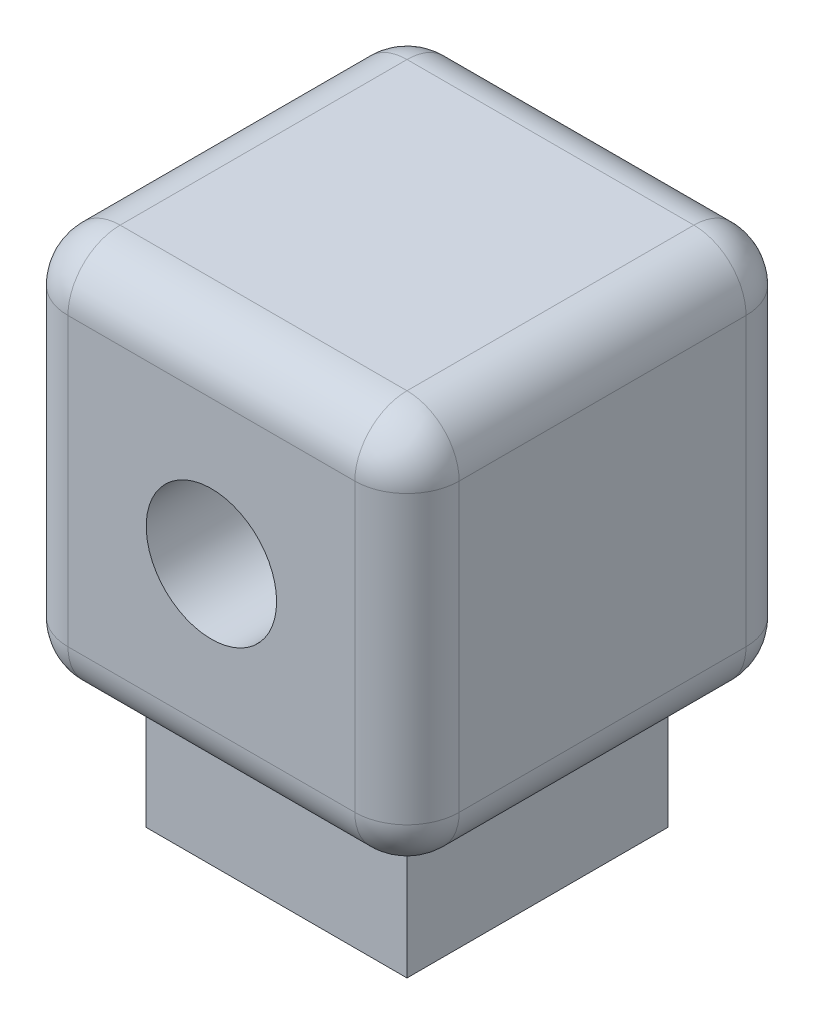
ISO-10303-21;
HEADER;
FILE_DESCRIPTION(('STEP AP214'),'2;1');
FILE_NAME('part.step','',(''),(''),'','','');
FILE_SCHEMA(('AUTOMOTIVE_DESIGN { 1 0 10303 214 1 1 1 1 }'));
ENDSEC;
DATA;
#1=APPLICATION_CONTEXT('core data for automotive mechanical design processes');
#2=APPLICATION_PROTOCOL_DEFINITION('international standard','automotive_design',2000,#1);
#3=PRODUCT_CONTEXT('',#1,'mechanical');
#4=PRODUCT('Part','Part','',(#3));
#5=PRODUCT_RELATED_PRODUCT_CATEGORY('part','',(#4));
#6=PRODUCT_DEFINITION_FORMATION('','',#4);
#7=PRODUCT_DEFINITION_CONTEXT('part definition',#1,'design');
#8=PRODUCT_DEFINITION('design','',#6,#7);
#9=PRODUCT_DEFINITION_SHAPE('','',#8);
#10=(LENGTH_UNIT() NAMED_UNIT(*) SI_UNIT(.MILLI.,.METRE.));
#11=(NAMED_UNIT(*) PLANE_ANGLE_UNIT() SI_UNIT($,.RADIAN.));
#12=(NAMED_UNIT(*) SI_UNIT($,.STERADIAN.) SOLID_ANGLE_UNIT());
#13=UNCERTAINTY_MEASURE_WITH_UNIT(LENGTH_MEASURE(1.E-05),#10,'distance_accuracy_value','');
#14=(GEOMETRIC_REPRESENTATION_CONTEXT(3) GLOBAL_UNCERTAINTY_ASSIGNED_CONTEXT((#13)) GLOBAL_UNIT_ASSIGNED_CONTEXT((#10,
#11,#12)) REPRESENTATION_CONTEXT('',''));
#15=CARTESIAN_POINT('',(0.,0.,0.));
#16=DIRECTION('',(0.,0.,1.));
#17=DIRECTION('',(1.,0.,0.));
#18=AXIS2_PLACEMENT_3D('',#15,#16,#17);
#19=CARTESIAN_POINT('',(12.9476930913001,15.,10.));
#20=DIRECTION('',(-1.,0.,0.));
#21=DIRECTION('',(0.,0.,1.));
#22=AXIS2_PLACEMENT_3D('',#19,#20,#21);
#23=PLANE('',#22);
#24=DIRECTION('',(0.,-1.,0.));
#25=VECTOR('',#24,1.);
#26=CARTESIAN_POINT('',(12.9476930913001,15.,8.));
#27=LINE('',#26,#25);
#28=CARTESIAN_POINT('',(12.9476930913001,13.,8.));
#29=VERTEX_POINT('',#28);
#30=CARTESIAN_POINT('',(12.9476930913001,2.,8.));
#31=VERTEX_POINT('',#30);
#32=EDGE_CURVE('E232',#29,#31,#27,.T.);
#33=ORIENTED_EDGE('',*,*,#32,.T.);
#34=DIRECTION('',(0.,0.,-1.));
#35=VECTOR('',#34,1.);
#36=CARTESIAN_POINT('',(12.9476930913001,2.,-5.));
#37=LINE('',#36,#35);
#38=CARTESIAN_POINT('',(12.9476930913001,2.,-3.));
#39=VERTEX_POINT('',#38);
#40=EDGE_CURVE('E238',#31,#39,#37,.T.);
#41=ORIENTED_EDGE('',*,*,#40,.T.);
#42=DIRECTION('',(0.,-1.,0.));
#43=VECTOR('',#42,1.);
#44=CARTESIAN_POINT('',(12.9476930913001,15.,-3.));
#45=LINE('',#44,#43);
#46=CARTESIAN_POINT('',(12.9476930913001,13.,-3.));
#47=VERTEX_POINT('',#46);
#48=EDGE_CURVE('E235',#39,#47,#45,.F.);
#49=ORIENTED_EDGE('',*,*,#48,.T.);
#50=DIRECTION('',(0.,0.,-1.));
#51=VECTOR('',#50,1.);
#52=CARTESIAN_POINT('',(12.9476930913001,13.,10.));
#53=LINE('',#52,#51);
#54=EDGE_CURVE('E229',#47,#29,#53,.F.);
#55=ORIENTED_EDGE('',*,*,#54,.T.);
#56=EDGE_LOOP('',(#33,#41,#49,#55));
#57=FACE_BOUND('',#56,.T.);
#58=ADVANCED_FACE('F39',(#57),#23,.F.);
#59=CARTESIAN_POINT('',(-2.05230690869991,15.,-5.));
#60=DIRECTION('',(0.,0.,1.));
#61=DIRECTION('',(1.,0.,0.));
#62=AXIS2_PLACEMENT_3D('',#59,#60,#61);
#63=PLANE('',#62);
#64=DIRECTION('',(0.,-1.,0.));
#65=VECTOR('',#64,1.);
#66=CARTESIAN_POINT('',(10.9476930913001,15.,-5.));
#67=LINE('',#66,#65);
#68=CARTESIAN_POINT('',(10.9476930913001,13.,-5.));
#69=VERTEX_POINT('',#68);
#70=CARTESIAN_POINT('',(10.9476930913001,2.,-5.));
#71=VERTEX_POINT('',#70);
#72=EDGE_CURVE('E219',#69,#71,#67,.T.);
#73=ORIENTED_EDGE('',*,*,#72,.T.);
#74=DIRECTION('',(-1.,0.,0.));
#75=VECTOR('',#74,1.);
#76=CARTESIAN_POINT('',(-2.05230690869991,2.,-5.));
#77=LINE('',#76,#75);
#78=CARTESIAN_POINT('',(-0.0523069086999055,2.,-5.));
#79=VERTEX_POINT('',#78);
#80=EDGE_CURVE('E225',#71,#79,#77,.T.);
#81=ORIENTED_EDGE('',*,*,#80,.T.);
#82=DIRECTION('',(0.,-1.,0.));
#83=VECTOR('',#82,1.);
#84=CARTESIAN_POINT('',(-0.0523069086999055,15.,-5.));
#85=LINE('',#84,#83);
#86=CARTESIAN_POINT('',(-0.0523069086999055,13.,-5.));
#87=VERTEX_POINT('',#86);
#88=EDGE_CURVE('E222',#79,#87,#85,.F.);
#89=ORIENTED_EDGE('',*,*,#88,.T.);
#90=DIRECTION('',(-1.,0.,0.));
#91=VECTOR('',#90,1.);
#92=CARTESIAN_POINT('',(-2.05230690869991,13.,-5.));
#93=LINE('',#92,#91);
#94=EDGE_CURVE('E216',#87,#69,#93,.F.);
#95=ORIENTED_EDGE('',*,*,#94,.T.);
#96=EDGE_LOOP('',(#73,#81,#89,#95));
#97=FACE_BOUND('',#96,.T.);
#98=CARTESIAN_POINT('',(5.44769309130009,7.5,-5.));
#99=DIRECTION('',(0.,0.,1.));
#100=DIRECTION('',(1.,0.,0.));
#101=AXIS2_PLACEMENT_3D('',#98,#99,#100);
#102=CIRCLE('',#101,2.5);
#103=CARTESIAN_POINT('',(7.94769309130009,7.5,-5.));
#104=VERTEX_POINT('',#103);
#105=EDGE_CURVE('E358',#104,#104,#102,.T.);
#106=ORIENTED_EDGE('',*,*,#105,.T.);
#107=EDGE_LOOP('',(#106));
#108=FACE_BOUND('',#107,.T.);
#109=ADVANCED_FACE('F406',(#97,#108),#63,.F.);
#110=CARTESIAN_POINT('',(-2.05230690869991,15.,10.));
#111=DIRECTION('',(1.,0.,0.));
#112=DIRECTION('',(0.,0.,-1.));
#113=AXIS2_PLACEMENT_3D('',#110,#111,#112);
#114=PLANE('',#113);
#115=DIRECTION('',(0.,-1.,0.));
#116=VECTOR('',#115,1.);
#117=CARTESIAN_POINT('',(-2.05230690869991,15.,-3.));
#118=LINE('',#117,#116);
#119=CARTESIAN_POINT('',(-2.05230690869991,13.,-3.));
#120=VERTEX_POINT('',#119);
#121=CARTESIAN_POINT('',(-2.05230690869991,2.,-3.));
#122=VERTEX_POINT('',#121);
#123=EDGE_CURVE('E188',#120,#122,#118,.T.);
#124=ORIENTED_EDGE('',*,*,#123,.T.);
#125=DIRECTION('',(0.,0.,1.));
#126=VECTOR('',#125,1.);
#127=CARTESIAN_POINT('',(-2.05230690869991,2.,10.));
#128=LINE('',#127,#126);
#129=CARTESIAN_POINT('',(-2.05230690869991,2.,8.));
#130=VERTEX_POINT('',#129);
#131=EDGE_CURVE('E199',#122,#130,#128,.T.);
#132=ORIENTED_EDGE('',*,*,#131,.T.);
#133=DIRECTION('',(0.,-1.,0.));
#134=VECTOR('',#133,1.);
#135=CARTESIAN_POINT('',(-2.05230690869991,15.,8.));
#136=LINE('',#135,#134);
#137=CARTESIAN_POINT('',(-2.05230690869991,13.,8.));
#138=VERTEX_POINT('',#137);
#139=EDGE_CURVE('E196',#130,#138,#136,.F.);
#140=ORIENTED_EDGE('',*,*,#139,.T.);
#141=DIRECTION('',(0.,0.,1.));
#142=VECTOR('',#141,1.);
#143=CARTESIAN_POINT('',(-2.05230690869991,13.,10.));
#144=LINE('',#143,#142);
#145=EDGE_CURVE('E184',#138,#120,#144,.F.);
#146=ORIENTED_EDGE('',*,*,#145,.T.);
#147=EDGE_LOOP('',(#124,#132,#140,#146));
#148=FACE_BOUND('',#147,.T.);
#149=ADVANCED_FACE('F412',(#148),#114,.F.);
#150=CARTESIAN_POINT('',(-2.05230690869991,15.,10.));
#151=DIRECTION('',(0.,0.,-1.));
#152=DIRECTION('',(-1.,0.,0.));
#153=AXIS2_PLACEMENT_3D('',#150,#151,#152);
#154=PLANE('',#153);
#155=DIRECTION('',(0.,-1.,0.));
#156=VECTOR('',#155,1.);
#157=CARTESIAN_POINT('',(-0.0523069086999055,15.,10.));
#158=LINE('',#157,#156);
#159=CARTESIAN_POINT('',(-0.0523069086999055,13.,10.));
#160=VERTEX_POINT('',#159);
#161=CARTESIAN_POINT('',(-0.0523069086999055,2.,10.));
#162=VERTEX_POINT('',#161);
#163=EDGE_CURVE('E248',#160,#162,#158,.T.);
#164=ORIENTED_EDGE('',*,*,#163,.T.);
#165=DIRECTION('',(1.,0.,0.));
#166=VECTOR('',#165,1.);
#167=CARTESIAN_POINT('',(12.9476930913001,2.,10.));
#168=LINE('',#167,#166);
#169=CARTESIAN_POINT('',(10.9476930913001,2.,10.));
#170=VERTEX_POINT('',#169);
#171=EDGE_CURVE('E251',#162,#170,#168,.T.);
#172=ORIENTED_EDGE('',*,*,#171,.T.);
#173=DIRECTION('',(0.,-1.,0.));
#174=VECTOR('',#173,1.);
#175=CARTESIAN_POINT('',(10.9476930913001,15.,10.));
#176=LINE('',#175,#174);
#177=CARTESIAN_POINT('',(10.9476930913001,13.,10.));
#178=VERTEX_POINT('',#177);
#179=EDGE_CURVE('E245',#170,#178,#176,.F.);
#180=ORIENTED_EDGE('',*,*,#179,.T.);
#181=DIRECTION('',(1.,0.,0.));
#182=VECTOR('',#181,1.);
#183=CARTESIAN_POINT('',(-2.05230690869991,13.,10.));
#184=LINE('',#183,#182);
#185=EDGE_CURVE('E242',#178,#160,#184,.F.);
#186=ORIENTED_EDGE('',*,*,#185,.T.);
#187=EDGE_LOOP('',(#164,#172,#180,#186));
#188=FACE_BOUND('',#187,.T.);
#189=CARTESIAN_POINT('',(5.44769309130009,7.5,10.));
#190=DIRECTION('',(0.,0.,1.));
#191=DIRECTION('',(1.,0.,0.));
#192=AXIS2_PLACEMENT_3D('',#189,#190,#191);
#193=CIRCLE('',#192,2.5);
#194=CARTESIAN_POINT('',(7.94769309130009,7.5,10.));
#195=VERTEX_POINT('',#194);
#196=EDGE_CURVE('E351',#195,#195,#193,.T.);
#197=ORIENTED_EDGE('',*,*,#196,.F.);
#198=EDGE_LOOP('',(#197));
#199=FACE_BOUND('',#198,.T.);
#200=ADVANCED_FACE('F402',(#188,#199),#154,.F.);
#201=CARTESIAN_POINT('',(0.,15.,0.));
#202=DIRECTION('',(0.,-1.,0.));
#203=DIRECTION('',(0.,0.,-1.));
#204=AXIS2_PLACEMENT_3D('',#201,#202,#203);
#205=PLANE('',#204);
#206=DIRECTION('',(-1.,0.,0.));
#207=VECTOR('',#206,1.);
#208=CARTESIAN_POINT('',(0.,15.,-3.));
#209=LINE('',#208,#207);
#210=CARTESIAN_POINT('',(10.9476930913001,15.,-3.));
#211=VERTEX_POINT('',#210);
#212=CARTESIAN_POINT('',(-0.0523069086999055,15.,-3.));
#213=VERTEX_POINT('',#212);
#214=EDGE_CURVE('E255',#211,#213,#209,.T.);
#215=ORIENTED_EDGE('',*,*,#214,.T.);
#216=DIRECTION('',(0.,0.,1.));
#217=VECTOR('',#216,1.);
#218=CARTESIAN_POINT('',(-0.0523069086999055,15.,0.));
#219=LINE('',#218,#217);
#220=CARTESIAN_POINT('',(-0.0523069086999055,15.,8.));
#221=VERTEX_POINT('',#220);
#222=EDGE_CURVE('E11',#213,#221,#219,.T.);
#223=ORIENTED_EDGE('',*,*,#222,.T.);
#224=DIRECTION('',(1.,0.,0.));
#225=VECTOR('',#224,1.);
#226=CARTESIAN_POINT('',(0.,15.,8.));
#227=LINE('',#226,#225);
#228=CARTESIAN_POINT('',(10.9476930913001,15.,8.));
#229=VERTEX_POINT('',#228);
#230=EDGE_CURVE('E49',#221,#229,#227,.T.);
#231=ORIENTED_EDGE('',*,*,#230,.T.);
#232=DIRECTION('',(0.,0.,-1.));
#233=VECTOR('',#232,1.);
#234=CARTESIAN_POINT('',(10.9476930913001,15.,0.));
#235=LINE('',#234,#233);
#236=EDGE_CURVE('E258',#229,#211,#235,.T.);
#237=ORIENTED_EDGE('',*,*,#236,.T.);
#238=EDGE_LOOP('',(#215,#223,#231,#237));
#239=FACE_BOUND('',#238,.T.);
#240=ADVANCED_FACE('F394',(#239),#205,.F.);
#241=CARTESIAN_POINT('',(0.,0.,0.));
#242=DIRECTION('',(0.,-1.,0.));
#243=DIRECTION('',(0.,0.,-1.));
#244=AXIS2_PLACEMENT_3D('',#241,#242,#243);
#245=PLANE('',#244);
#246=DIRECTION('',(1.,0.,0.));
#247=VECTOR('',#246,1.);
#248=CARTESIAN_POINT('',(-2.05230690869991,0.,8.));
#249=LINE('',#248,#247);
#250=CARTESIAN_POINT('',(10.9476930913001,0.,8.));
#251=VERTEX_POINT('',#250);
#252=CARTESIAN_POINT('',(-0.0523069086999055,0.,8.));
#253=VERTEX_POINT('',#252);
#254=EDGE_CURVE('E203',#251,#253,#249,.F.);
#255=ORIENTED_EDGE('',*,*,#254,.T.);
#256=DIRECTION('',(0.,0.,1.));
#257=VECTOR('',#256,1.);
#258=CARTESIAN_POINT('',(-0.0523069086999055,0.,-5.));
#259=LINE('',#258,#257);
#260=CARTESIAN_POINT('',(-0.0523069086999055,0.,-3.));
#261=VERTEX_POINT('',#260);
#262=EDGE_CURVE('E212',#253,#261,#259,.F.);
#263=ORIENTED_EDGE('',*,*,#262,.T.);
#264=DIRECTION('',(-1.,0.,0.));
#265=VECTOR('',#264,1.);
#266=CARTESIAN_POINT('',(12.9476930913001,0.,-3.));
#267=LINE('',#266,#265);
#268=CARTESIAN_POINT('',(10.9476930913001,0.,-3.));
#269=VERTEX_POINT('',#268);
#270=EDGE_CURVE('E209',#261,#269,#267,.F.);
#271=ORIENTED_EDGE('',*,*,#270,.T.);
#272=DIRECTION('',(0.,0.,-1.));
#273=VECTOR('',#272,1.);
#274=CARTESIAN_POINT('',(10.9476930913001,0.,10.));
#275=LINE('',#274,#273);
#276=EDGE_CURVE('E206',#269,#251,#275,.F.);
#277=ORIENTED_EDGE('',*,*,#276,.T.);
#278=EDGE_LOOP('',(#255,#263,#271,#277));
#279=FACE_BOUND('',#278,.T.);
#280=DIRECTION('',(0.,0.,1.));
#281=VECTOR('',#280,1.);
#282=CARTESIAN_POINT('',(10.4476930913001,0.,7.5));
#283=LINE('',#282,#281);
#284=CARTESIAN_POINT('',(10.4476930913001,0.,-2.5));
#285=VERTEX_POINT('',#284);
#286=CARTESIAN_POINT('',(10.4476930913001,0.,7.5));
#287=VERTEX_POINT('',#286);
#288=EDGE_CURVE('E182',#285,#287,#283,.T.);
#289=ORIENTED_EDGE('',*,*,#288,.F.);
#290=DIRECTION('',(1.,0.,0.));
#291=VECTOR('',#290,1.);
#292=CARTESIAN_POINT('',(0.447693091300095,0.,-2.5));
#293=LINE('',#292,#291);
#294=CARTESIAN_POINT('',(0.447693091300095,0.,-2.5));
#295=VERTEX_POINT('',#294);
#296=EDGE_CURVE('E179',#295,#285,#293,.T.);
#297=ORIENTED_EDGE('',*,*,#296,.F.);
#298=DIRECTION('',(0.,0.,-1.));
#299=VECTOR('',#298,1.);
#300=CARTESIAN_POINT('',(0.447693091300094,0.,7.5));
#301=LINE('',#300,#299);
#302=CARTESIAN_POINT('',(0.447693091300094,0.,7.5));
#303=VERTEX_POINT('',#302);
#304=EDGE_CURVE('E376',#303,#295,#301,.T.);
#305=ORIENTED_EDGE('',*,*,#304,.F.);
#306=DIRECTION('',(-1.,0.,0.));
#307=VECTOR('',#306,1.);
#308=CARTESIAN_POINT('',(0.447693091300094,0.,7.5));
#309=LINE('',#308,#307);
#310=EDGE_CURVE('E373',#287,#303,#309,.T.);
#311=ORIENTED_EDGE('',*,*,#310,.F.);
#312=EDGE_LOOP('',(#289,#297,#305,#311));
#313=FACE_BOUND('',#312,.T.);
#314=ADVANCED_FACE('F392',(#279,#313),#245,.T.);
#315=CARTESIAN_POINT('',(10.4476930913001,-5.,7.5));
#316=DIRECTION('',(-1.,0.,0.));
#317=DIRECTION('',(0.,0.,1.));
#318=AXIS2_PLACEMENT_3D('',#315,#316,#317);
#319=PLANE('',#318);
#320=ORIENTED_EDGE('',*,*,#288,.T.);
#321=DIRECTION('',(0.,1.,0.));
#322=VECTOR('',#321,1.);
#323=CARTESIAN_POINT('',(10.4476930913001,-5.,7.5));
#324=LINE('',#323,#322);
#325=CARTESIAN_POINT('',(10.4476930913001,-5.,7.5));
#326=VERTEX_POINT('',#325);
#327=EDGE_CURVE('E161',#326,#287,#324,.T.);
#328=ORIENTED_EDGE('',*,*,#327,.F.);
#329=DIRECTION('',(0.,0.,1.));
#330=VECTOR('',#329,1.);
#331=CARTESIAN_POINT('',(10.4476930913001,-5.,7.5));
#332=LINE('',#331,#330);
#333=CARTESIAN_POINT('',(10.4476930913001,-5.,-2.5));
#334=VERTEX_POINT('',#333);
#335=EDGE_CURVE('E169',#334,#326,#332,.T.);
#336=ORIENTED_EDGE('',*,*,#335,.F.);
#337=DIRECTION('',(0.,1.,0.));
#338=VECTOR('',#337,1.);
#339=CARTESIAN_POINT('',(10.4476930913001,-5.,-2.5));
#340=LINE('',#339,#338);
#341=EDGE_CURVE('E370',#334,#285,#340,.T.);
#342=ORIENTED_EDGE('',*,*,#341,.T.);
#343=EDGE_LOOP('',(#320,#328,#336,#342));
#344=FACE_BOUND('',#343,.T.);
#345=ADVANCED_FACE('F181',(#344),#319,.F.);
#346=CARTESIAN_POINT('',(0.447693091300094,-5.,7.5));
#347=DIRECTION('',(0.,0.,-1.));
#348=DIRECTION('',(-1.,0.,0.));
#349=AXIS2_PLACEMENT_3D('',#346,#347,#348);
#350=PLANE('',#349);
#351=ORIENTED_EDGE('',*,*,#310,.T.);
#352=DIRECTION('',(0.,1.,0.));
#353=VECTOR('',#352,1.);
#354=CARTESIAN_POINT('',(0.447693091300094,-5.,7.5));
#355=LINE('',#354,#353);
#356=CARTESIAN_POINT('',(0.447693091300094,-5.,7.5));
#357=VERTEX_POINT('',#356);
#358=EDGE_CURVE('E164',#357,#303,#355,.T.);
#359=ORIENTED_EDGE('',*,*,#358,.F.);
#360=DIRECTION('',(-1.,0.,0.));
#361=VECTOR('',#360,1.);
#362=CARTESIAN_POINT('',(0.447693091300094,-5.,7.5));
#363=LINE('',#362,#361);
#364=EDGE_CURVE('E156',#326,#357,#363,.T.);
#365=ORIENTED_EDGE('',*,*,#364,.F.);
#366=ORIENTED_EDGE('',*,*,#327,.T.);
#367=EDGE_LOOP('',(#351,#359,#365,#366));
#368=FACE_BOUND('',#367,.T.);
#369=ADVANCED_FACE('F159',(#368),#350,.F.);
#370=CARTESIAN_POINT('',(0.447693091300094,-5.,7.5));
#371=DIRECTION('',(1.,0.,0.));
#372=DIRECTION('',(0.,0.,-1.));
#373=AXIS2_PLACEMENT_3D('',#370,#371,#372);
#374=PLANE('',#373);
#375=ORIENTED_EDGE('',*,*,#304,.T.);
#376=DIRECTION('',(0.,1.,0.));
#377=VECTOR('',#376,1.);
#378=CARTESIAN_POINT('',(0.447693091300095,-5.,-2.5));
#379=LINE('',#378,#377);
#380=CARTESIAN_POINT('',(0.447693091300095,-5.,-2.5));
#381=VERTEX_POINT('',#380);
#382=EDGE_CURVE('E190',#381,#295,#379,.T.);
#383=ORIENTED_EDGE('',*,*,#382,.F.);
#384=DIRECTION('',(0.,0.,-1.));
#385=VECTOR('',#384,1.);
#386=CARTESIAN_POINT('',(0.447693091300094,-5.,7.5));
#387=LINE('',#386,#385);
#388=EDGE_CURVE('E168',#357,#381,#387,.T.);
#389=ORIENTED_EDGE('',*,*,#388,.F.);
#390=ORIENTED_EDGE('',*,*,#358,.T.);
#391=EDGE_LOOP('',(#375,#383,#389,#390));
#392=FACE_BOUND('',#391,.T.);
#393=ADVANCED_FACE('F390',(#392),#374,.F.);
#394=CARTESIAN_POINT('',(0.447693091300095,-5.,-2.5));
#395=DIRECTION('',(0.,0.,1.));
#396=DIRECTION('',(1.,0.,0.));
#397=AXIS2_PLACEMENT_3D('',#394,#395,#396);
#398=PLANE('',#397);
#399=ORIENTED_EDGE('',*,*,#296,.T.);
#400=ORIENTED_EDGE('',*,*,#341,.F.);
#401=DIRECTION('',(1.,0.,0.));
#402=VECTOR('',#401,1.);
#403=CARTESIAN_POINT('',(0.447693091300095,-5.,-2.5));
#404=LINE('',#403,#402);
#405=EDGE_CURVE('E174',#381,#334,#404,.T.);
#406=ORIENTED_EDGE('',*,*,#405,.F.);
#407=ORIENTED_EDGE('',*,*,#382,.T.);
#408=EDGE_LOOP('',(#399,#400,#406,#407));
#409=FACE_BOUND('',#408,.T.);
#410=ADVANCED_FACE('F388',(#409),#398,.F.);
#411=CARTESIAN_POINT('',(0.,-5.,0.));
#412=DIRECTION('',(0.,-1.,0.));
#413=DIRECTION('',(0.,0.,-1.));
#414=AXIS2_PLACEMENT_3D('',#411,#412,#413);
#415=PLANE('',#414);
#416=ORIENTED_EDGE('',*,*,#335,.T.);
#417=ORIENTED_EDGE('',*,*,#364,.T.);
#418=ORIENTED_EDGE('',*,*,#388,.T.);
#419=ORIENTED_EDGE('',*,*,#405,.T.);
#420=EDGE_LOOP('',(#416,#417,#418,#419));
#421=FACE_BOUND('',#420,.T.);
#422=ADVANCED_FACE('F172',(#421),#415,.T.);
#423=CARTESIAN_POINT('',(5.44769309130009,7.5,-5.));
#424=DIRECTION('',(0.,0.,1.));
#425=DIRECTION('',(1.,0.,0.));
#426=AXIS2_PLACEMENT_3D('',#423,#424,#425);
#427=CYLINDRICAL_SURFACE('',#426,2.5);
#428=ORIENTED_EDGE('',*,*,#105,.F.);
#429=EDGE_LOOP('',(#428));
#430=FACE_BOUND('',#429,.T.);
#431=ORIENTED_EDGE('',*,*,#196,.T.);
#432=EDGE_LOOP('',(#431));
#433=FACE_BOUND('',#432,.T.);
#434=ADVANCED_FACE('F491',(#430,#433),#427,.F.);
#435=CARTESIAN_POINT('',(10.9476930913001,13.,0.));
#436=DIRECTION('',(0.,0.,-1.));
#437=DIRECTION('',(-1.,0.,0.));
#438=AXIS2_PLACEMENT_3D('',#435,#436,#437);
#439=CYLINDRICAL_SURFACE('',#438,2.);
#440=CARTESIAN_POINT('',(10.9476930913001,13.,-3.));
#441=DIRECTION('',(0.,0.,-1.));
#442=DIRECTION('',(-1.,0.,0.));
#443=AXIS2_PLACEMENT_3D('',#440,#441,#442);
#444=CIRCLE('',#443,2.);
#445=EDGE_CURVE('E43',#211,#47,#444,.T.);
#446=ORIENTED_EDGE('',*,*,#445,.F.);
#447=ORIENTED_EDGE('',*,*,#236,.F.);
#448=CARTESIAN_POINT('',(10.9476930913001,13.,8.));
#449=DIRECTION('',(0.,0.,1.));
#450=DIRECTION('',(1.,0.,0.));
#451=AXIS2_PLACEMENT_3D('',#448,#449,#450);
#452=CIRCLE('',#451,2.);
#453=EDGE_CURVE('E342',#29,#229,#452,.T.);
#454=ORIENTED_EDGE('',*,*,#453,.F.);
#455=ORIENTED_EDGE('',*,*,#54,.F.);
#456=EDGE_LOOP('',(#446,#447,#454,#455));
#457=FACE_BOUND('',#456,.T.);
#458=ADVANCED_FACE('F41',(#457),#439,.T.);
#459=CARTESIAN_POINT('',(10.9476930913001,13.,-3.));
#460=DIRECTION('',(0.,0.,1.));
#461=DIRECTION('',(1.,0.,0.));
#462=AXIS2_PLACEMENT_3D('',#459,#460,#461);
#463=SPHERICAL_SURFACE('',#462,2.);
#464=CARTESIAN_POINT('',(10.9476930913001,13.,-3.));
#465=DIRECTION('',(1.,0.,0.));
#466=DIRECTION('',(0.,0.,-1.));
#467=AXIS2_PLACEMENT_3D('',#464,#465,#466);
#468=CIRCLE('',#467,2.);
#469=EDGE_CURVE('E335',#211,#69,#468,.F.);
#470=ORIENTED_EDGE('',*,*,#469,.F.);
#471=ORIENTED_EDGE('',*,*,#445,.T.);
#472=CARTESIAN_POINT('',(10.9476930913001,13.,-3.));
#473=DIRECTION('',(0.,1.,0.));
#474=DIRECTION('',(0.,0.,1.));
#475=AXIS2_PLACEMENT_3D('',#472,#473,#474);
#476=CIRCLE('',#475,2.);
#477=EDGE_CURVE('E339',#69,#47,#476,.F.);
#478=ORIENTED_EDGE('',*,*,#477,.F.);
#479=EDGE_LOOP('',(#470,#471,#478));
#480=FACE_BOUND('',#479,.T.);
#481=ADVANCED_FACE('F486',(#480),#463,.T.);
#482=CARTESIAN_POINT('',(10.9476930913001,13.,8.));
#483=DIRECTION('',(0.,0.,1.));
#484=DIRECTION('',(1.,0.,0.));
#485=AXIS2_PLACEMENT_3D('',#482,#483,#484);
#486=SPHERICAL_SURFACE('',#485,2.);
#487=CARTESIAN_POINT('',(10.9476930913001,13.,8.));
#488=DIRECTION('',(0.,1.,0.));
#489=DIRECTION('',(0.,0.,1.));
#490=AXIS2_PLACEMENT_3D('',#487,#488,#489);
#491=CIRCLE('',#490,2.);
#492=EDGE_CURVE('E327',#29,#178,#491,.F.);
#493=ORIENTED_EDGE('',*,*,#492,.F.);
#494=ORIENTED_EDGE('',*,*,#453,.T.);
#495=CARTESIAN_POINT('',(10.9476930913001,13.,8.));
#496=DIRECTION('',(1.,0.,0.));
#497=DIRECTION('',(0.,0.,-1.));
#498=AXIS2_PLACEMENT_3D('',#495,#496,#497);
#499=CIRCLE('',#498,2.);
#500=EDGE_CURVE('E331',#178,#229,#499,.F.);
#501=ORIENTED_EDGE('',*,*,#500,.F.);
#502=EDGE_LOOP('',(#493,#494,#501));
#503=FACE_BOUND('',#502,.T.);
#504=ADVANCED_FACE('F483',(#503),#486,.T.);
#505=CARTESIAN_POINT('',(10.9476930913001,15.,-3.));
#506=DIRECTION('',(0.,-1.,0.));
#507=DIRECTION('',(0.,0.,-1.));
#508=AXIS2_PLACEMENT_3D('',#505,#506,#507);
#509=CYLINDRICAL_SURFACE('',#508,2.);
#510=ORIENTED_EDGE('',*,*,#477,.T.);
#511=ORIENTED_EDGE('',*,*,#48,.F.);
#512=CARTESIAN_POINT('',(10.9476930913001,2.,-3.));
#513=DIRECTION('',(0.,-1.,0.));
#514=DIRECTION('',(0.,0.,-1.));
#515=AXIS2_PLACEMENT_3D('',#512,#513,#514);
#516=CIRCLE('',#515,2.);
#517=EDGE_CURVE('E320',#71,#39,#516,.T.);
#518=ORIENTED_EDGE('',*,*,#517,.F.);
#519=ORIENTED_EDGE('',*,*,#72,.F.);
#520=EDGE_LOOP('',(#510,#511,#518,#519));
#521=FACE_BOUND('',#520,.T.);
#522=ADVANCED_FACE('F479',(#521),#509,.T.);
#523=CARTESIAN_POINT('',(0.,13.,-3.));
#524=DIRECTION('',(-1.,0.,0.));
#525=DIRECTION('',(0.,0.,1.));
#526=AXIS2_PLACEMENT_3D('',#523,#524,#525);
#527=CYLINDRICAL_SURFACE('',#526,2.);
#528=ORIENTED_EDGE('',*,*,#469,.T.);
#529=ORIENTED_EDGE('',*,*,#94,.F.);
#530=CARTESIAN_POINT('',(-0.0523069086999055,13.,-3.));
#531=DIRECTION('',(-1.,0.,0.));
#532=DIRECTION('',(0.,0.,1.));
#533=AXIS2_PLACEMENT_3D('',#530,#531,#532);
#534=CIRCLE('',#533,2.);
#535=EDGE_CURVE('E316',#213,#87,#534,.T.);
#536=ORIENTED_EDGE('',*,*,#535,.F.);
#537=ORIENTED_EDGE('',*,*,#214,.F.);
#538=EDGE_LOOP('',(#528,#529,#536,#537));
#539=FACE_BOUND('',#538,.T.);
#540=ADVANCED_FACE('F475',(#539),#527,.T.);
#541=CARTESIAN_POINT('',(-0.0523069086999055,13.,0.));
#542=DIRECTION('',(0.,0.,1.));
#543=DIRECTION('',(1.,0.,0.));
#544=AXIS2_PLACEMENT_3D('',#541,#542,#543);
#545=CYLINDRICAL_SURFACE('',#544,2.);
#546=CARTESIAN_POINT('',(-0.0523069086999055,13.,8.));
#547=DIRECTION('',(0.,0.,1.));
#548=DIRECTION('',(1.,0.,0.));
#549=AXIS2_PLACEMENT_3D('',#546,#547,#548);
#550=CIRCLE('',#549,2.);
#551=EDGE_CURVE('E309',#221,#138,#550,.T.);
#552=ORIENTED_EDGE('',*,*,#551,.F.);
#553=ORIENTED_EDGE('',*,*,#222,.F.);
#554=CARTESIAN_POINT('',(-0.0523069086999055,13.,-3.));
#555=DIRECTION('',(0.,0.,-1.));
#556=DIRECTION('',(-1.,0.,0.));
#557=AXIS2_PLACEMENT_3D('',#554,#555,#556);
#558=CIRCLE('',#557,2.);
#559=EDGE_CURVE('E312',#120,#213,#558,.T.);
#560=ORIENTED_EDGE('',*,*,#559,.F.);
#561=ORIENTED_EDGE('',*,*,#145,.F.);
#562=EDGE_LOOP('',(#552,#553,#560,#561));
#563=FACE_BOUND('',#562,.T.);
#564=ADVANCED_FACE('F471',(#563),#545,.T.);
#565=CARTESIAN_POINT('',(0.,13.,8.));
#566=DIRECTION('',(1.,0.,0.));
#567=DIRECTION('',(0.,0.,-1.));
#568=AXIS2_PLACEMENT_3D('',#565,#566,#567);
#569=CYLINDRICAL_SURFACE('',#568,2.);
#570=ORIENTED_EDGE('',*,*,#500,.T.);
#571=ORIENTED_EDGE('',*,*,#230,.F.);
#572=CARTESIAN_POINT('',(-0.0523069086999055,13.,8.));
#573=DIRECTION('',(-1.,0.,0.));
#574=DIRECTION('',(0.,0.,1.));
#575=AXIS2_PLACEMENT_3D('',#572,#573,#574);
#576=CIRCLE('',#575,2.);
#577=EDGE_CURVE('E57',#160,#221,#576,.T.);
#578=ORIENTED_EDGE('',*,*,#577,.F.);
#579=ORIENTED_EDGE('',*,*,#185,.F.);
#580=EDGE_LOOP('',(#570,#571,#578,#579));
#581=FACE_BOUND('',#580,.T.);
#582=ADVANCED_FACE('F467',(#581),#569,.T.);
#583=CARTESIAN_POINT('',(10.9476930913001,15.,8.));
#584=DIRECTION('',(0.,-1.,0.));
#585=DIRECTION('',(0.,0.,-1.));
#586=AXIS2_PLACEMENT_3D('',#583,#584,#585);
#587=CYLINDRICAL_SURFACE('',#586,2.);
#588=ORIENTED_EDGE('',*,*,#492,.T.);
#589=ORIENTED_EDGE('',*,*,#179,.F.);
#590=CARTESIAN_POINT('',(10.9476930913001,2.,8.));
#591=DIRECTION('',(0.,-1.,0.));
#592=DIRECTION('',(0.,0.,-1.));
#593=AXIS2_PLACEMENT_3D('',#590,#591,#592);
#594=CIRCLE('',#593,2.);
#595=EDGE_CURVE('E303',#31,#170,#594,.T.);
#596=ORIENTED_EDGE('',*,*,#595,.F.);
#597=ORIENTED_EDGE('',*,*,#32,.F.);
#598=EDGE_LOOP('',(#588,#589,#596,#597));
#599=FACE_BOUND('',#598,.T.);
#600=ADVANCED_FACE('F463',(#599),#587,.T.);
#601=CARTESIAN_POINT('',(10.9476930913001,2.,10.));
#602=DIRECTION('',(0.,0.,1.));
#603=DIRECTION('',(1.,0.,0.));
#604=AXIS2_PLACEMENT_3D('',#601,#602,#603);
#605=CYLINDRICAL_SURFACE('',#604,2.);
#606=CARTESIAN_POINT('',(10.9476930913001,2.,-3.));
#607=DIRECTION('',(0.,0.,-1.));
#608=DIRECTION('',(-1.,0.,0.));
#609=AXIS2_PLACEMENT_3D('',#606,#607,#608);
#610=CIRCLE('',#609,2.);
#611=EDGE_CURVE('E323',#39,#269,#610,.T.);
#612=ORIENTED_EDGE('',*,*,#611,.F.);
#613=ORIENTED_EDGE('',*,*,#40,.F.);
#614=CARTESIAN_POINT('',(10.9476930913001,2.,8.));
#615=DIRECTION('',(0.,0.,1.));
#616=DIRECTION('',(1.,0.,0.));
#617=AXIS2_PLACEMENT_3D('',#614,#615,#616);
#618=CIRCLE('',#617,2.);
#619=EDGE_CURVE('E299',#251,#31,#618,.T.);
#620=ORIENTED_EDGE('',*,*,#619,.F.);
#621=ORIENTED_EDGE('',*,*,#276,.F.);
#622=EDGE_LOOP('',(#612,#613,#620,#621));
#623=FACE_BOUND('',#622,.T.);
#624=ADVANCED_FACE('F459',(#623),#605,.T.);
#625=CARTESIAN_POINT('',(10.9476930913001,2.,-3.));
#626=DIRECTION('',(0.,0.,1.));
#627=DIRECTION('',(1.,0.,0.));
#628=AXIS2_PLACEMENT_3D('',#625,#626,#627);
#629=SPHERICAL_SURFACE('',#628,2.);
#630=ORIENTED_EDGE('',*,*,#517,.T.);
#631=ORIENTED_EDGE('',*,*,#611,.T.);
#632=CARTESIAN_POINT('',(10.9476930913001,2.,-3.));
#633=DIRECTION('',(1.,0.,0.));
#634=DIRECTION('',(0.,0.,-1.));
#635=AXIS2_PLACEMENT_3D('',#632,#633,#634);
#636=CIRCLE('',#635,2.);
#637=EDGE_CURVE('E295',#71,#269,#636,.F.);
#638=ORIENTED_EDGE('',*,*,#637,.F.);
#639=EDGE_LOOP('',(#630,#631,#638));
#640=FACE_BOUND('',#639,.T.);
#641=ADVANCED_FACE('F455',(#640),#629,.T.);
#642=CARTESIAN_POINT('',(-0.0523069086999055,13.,-3.));
#643=DIRECTION('',(0.,0.,1.));
#644=DIRECTION('',(1.,0.,0.));
#645=AXIS2_PLACEMENT_3D('',#642,#643,#644);
#646=SPHERICAL_SURFACE('',#645,2.);
#647=ORIENTED_EDGE('',*,*,#559,.T.);
#648=ORIENTED_EDGE('',*,*,#535,.T.);
#649=CARTESIAN_POINT('',(-0.0523069086999055,13.,-3.));
#650=DIRECTION('',(0.,1.,0.));
#651=DIRECTION('',(0.,0.,1.));
#652=AXIS2_PLACEMENT_3D('',#649,#650,#651);
#653=CIRCLE('',#652,2.);
#654=EDGE_CURVE('E291',#120,#87,#653,.F.);
#655=ORIENTED_EDGE('',*,*,#654,.F.);
#656=EDGE_LOOP('',(#647,#648,#655));
#657=FACE_BOUND('',#656,.T.);
#658=ADVANCED_FACE('F452',(#657),#646,.T.);
#659=CARTESIAN_POINT('',(-0.0523069086999055,13.,8.));
#660=DIRECTION('',(0.,0.,1.));
#661=DIRECTION('',(1.,0.,0.));
#662=AXIS2_PLACEMENT_3D('',#659,#660,#661);
#663=SPHERICAL_SURFACE('',#662,2.);
#664=ORIENTED_EDGE('',*,*,#577,.T.);
#665=ORIENTED_EDGE('',*,*,#551,.T.);
#666=CARTESIAN_POINT('',(-0.0523069086999055,13.,8.));
#667=DIRECTION('',(0.,1.,0.));
#668=DIRECTION('',(0.,0.,1.));
#669=AXIS2_PLACEMENT_3D('',#666,#667,#668);
#670=CIRCLE('',#669,2.);
#671=EDGE_CURVE('E287',#160,#138,#670,.F.);
#672=ORIENTED_EDGE('',*,*,#671,.F.);
#673=EDGE_LOOP('',(#664,#665,#672));
#674=FACE_BOUND('',#673,.T.);
#675=ADVANCED_FACE('F448',(#674),#663,.T.);
#676=CARTESIAN_POINT('',(10.9476930913001,2.,8.));
#677=DIRECTION('',(0.,0.,1.));
#678=DIRECTION('',(1.,0.,0.));
#679=AXIS2_PLACEMENT_3D('',#676,#677,#678);
#680=SPHERICAL_SURFACE('',#679,2.);
#681=ORIENTED_EDGE('',*,*,#619,.T.);
#682=ORIENTED_EDGE('',*,*,#595,.T.);
#683=CARTESIAN_POINT('',(10.9476930913001,2.,8.));
#684=DIRECTION('',(1.,0.,0.));
#685=DIRECTION('',(0.,0.,-1.));
#686=AXIS2_PLACEMENT_3D('',#683,#684,#685);
#687=CIRCLE('',#686,2.);
#688=EDGE_CURVE('E284',#251,#170,#687,.F.);
#689=ORIENTED_EDGE('',*,*,#688,.F.);
#690=EDGE_LOOP('',(#681,#682,#689));
#691=FACE_BOUND('',#690,.T.);
#692=ADVANCED_FACE('F444',(#691),#680,.T.);
#693=CARTESIAN_POINT('',(-2.05230690869991,2.,-3.));
#694=DIRECTION('',(1.,0.,0.));
#695=DIRECTION('',(0.,0.,-1.));
#696=AXIS2_PLACEMENT_3D('',#693,#694,#695);
#697=CYLINDRICAL_SURFACE('',#696,2.);
#698=ORIENTED_EDGE('',*,*,#637,.T.);
#699=ORIENTED_EDGE('',*,*,#270,.F.);
#700=CARTESIAN_POINT('',(-0.0523069086999055,2.,-3.));
#701=DIRECTION('',(-1.,0.,0.));
#702=DIRECTION('',(0.,0.,1.));
#703=AXIS2_PLACEMENT_3D('',#700,#701,#702);
#704=CIRCLE('',#703,2.);
#705=EDGE_CURVE('E280',#79,#261,#704,.T.);
#706=ORIENTED_EDGE('',*,*,#705,.F.);
#707=ORIENTED_EDGE('',*,*,#80,.F.);
#708=EDGE_LOOP('',(#698,#699,#706,#707));
#709=FACE_BOUND('',#708,.T.);
#710=ADVANCED_FACE('F440',(#709),#697,.T.);
#711=CARTESIAN_POINT('',(-0.0523069086999055,15.,-3.));
#712=DIRECTION('',(0.,-1.,0.));
#713=DIRECTION('',(0.,0.,-1.));
#714=AXIS2_PLACEMENT_3D('',#711,#712,#713);
#715=CYLINDRICAL_SURFACE('',#714,2.);
#716=ORIENTED_EDGE('',*,*,#654,.T.);
#717=ORIENTED_EDGE('',*,*,#88,.F.);
#718=CARTESIAN_POINT('',(-0.0523069086999055,2.,-3.));
#719=DIRECTION('',(0.,-1.,0.));
#720=DIRECTION('',(0.,0.,-1.));
#721=AXIS2_PLACEMENT_3D('',#718,#719,#720);
#722=CIRCLE('',#721,2.);
#723=EDGE_CURVE('E277',#122,#79,#722,.T.);
#724=ORIENTED_EDGE('',*,*,#723,.F.);
#725=ORIENTED_EDGE('',*,*,#123,.F.);
#726=EDGE_LOOP('',(#716,#717,#724,#725));
#727=FACE_BOUND('',#726,.T.);
#728=ADVANCED_FACE('F436',(#727),#715,.T.);
#729=CARTESIAN_POINT('',(-0.0523069086999055,15.,8.));
#730=DIRECTION('',(0.,-1.,0.));
#731=DIRECTION('',(0.,0.,-1.));
#732=AXIS2_PLACEMENT_3D('',#729,#730,#731);
#733=CYLINDRICAL_SURFACE('',#732,2.);
#734=ORIENTED_EDGE('',*,*,#671,.T.);
#735=ORIENTED_EDGE('',*,*,#139,.F.);
#736=CARTESIAN_POINT('',(-0.0523069086999055,2.,8.));
#737=DIRECTION('',(0.,-1.,0.));
#738=DIRECTION('',(0.,0.,-1.));
#739=AXIS2_PLACEMENT_3D('',#736,#737,#738);
#740=CIRCLE('',#739,2.);
#741=EDGE_CURVE('E273',#162,#130,#740,.T.);
#742=ORIENTED_EDGE('',*,*,#741,.F.);
#743=ORIENTED_EDGE('',*,*,#163,.F.);
#744=EDGE_LOOP('',(#734,#735,#742,#743));
#745=FACE_BOUND('',#744,.T.);
#746=ADVANCED_FACE('F432',(#745),#733,.T.);
#747=CARTESIAN_POINT('',(-2.05230690869991,2.,8.));
#748=DIRECTION('',(-1.,0.,0.));
#749=DIRECTION('',(0.,0.,1.));
#750=AXIS2_PLACEMENT_3D('',#747,#748,#749);
#751=CYLINDRICAL_SURFACE('',#750,2.);
#752=ORIENTED_EDGE('',*,*,#688,.T.);
#753=ORIENTED_EDGE('',*,*,#171,.F.);
#754=CARTESIAN_POINT('',(-0.0523069086999055,2.,8.));
#755=DIRECTION('',(-1.,0.,0.));
#756=DIRECTION('',(0.,0.,1.));
#757=AXIS2_PLACEMENT_3D('',#754,#755,#756);
#758=CIRCLE('',#757,2.);
#759=EDGE_CURVE('E269',#253,#162,#758,.T.);
#760=ORIENTED_EDGE('',*,*,#759,.F.);
#761=ORIENTED_EDGE('',*,*,#254,.F.);
#762=EDGE_LOOP('',(#752,#753,#760,#761));
#763=FACE_BOUND('',#762,.T.);
#764=ADVANCED_FACE('F428',(#763),#751,.T.);
#765=CARTESIAN_POINT('',(-0.0523069086999055,2.,-3.));
#766=DIRECTION('',(0.,0.,1.));
#767=DIRECTION('',(1.,0.,0.));
#768=AXIS2_PLACEMENT_3D('',#765,#766,#767);
#769=SPHERICAL_SURFACE('',#768,2.);
#770=ORIENTED_EDGE('',*,*,#723,.T.);
#771=ORIENTED_EDGE('',*,*,#705,.T.);
#772=CARTESIAN_POINT('',(-0.0523069086999055,2.,-3.));
#773=DIRECTION('',(0.,0.,-1.));
#774=DIRECTION('',(-1.,0.,0.));
#775=AXIS2_PLACEMENT_3D('',#772,#773,#774);
#776=CIRCLE('',#775,2.);
#777=EDGE_CURVE('E266',#122,#261,#776,.F.);
#778=ORIENTED_EDGE('',*,*,#777,.F.);
#779=EDGE_LOOP('',(#770,#771,#778));
#780=FACE_BOUND('',#779,.T.);
#781=ADVANCED_FACE('F424',(#780),#769,.T.);
#782=CARTESIAN_POINT('',(-0.0523069086999055,2.,8.));
#783=DIRECTION('',(0.,0.,1.));
#784=DIRECTION('',(1.,0.,0.));
#785=AXIS2_PLACEMENT_3D('',#782,#783,#784);
#786=SPHERICAL_SURFACE('',#785,2.);
#787=ORIENTED_EDGE('',*,*,#759,.T.);
#788=ORIENTED_EDGE('',*,*,#741,.T.);
#789=CARTESIAN_POINT('',(-0.0523069086999055,2.,8.));
#790=DIRECTION('',(0.,0.,1.));
#791=DIRECTION('',(1.,0.,0.));
#792=AXIS2_PLACEMENT_3D('',#789,#790,#791);
#793=CIRCLE('',#792,2.);
#794=EDGE_CURVE('E263',#253,#130,#793,.F.);
#795=ORIENTED_EDGE('',*,*,#794,.F.);
#796=EDGE_LOOP('',(#787,#788,#795));
#797=FACE_BOUND('',#796,.T.);
#798=ADVANCED_FACE('F420',(#797),#786,.T.);
#799=CARTESIAN_POINT('',(-0.0523069086999055,2.,10.));
#800=DIRECTION('',(0.,0.,-1.));
#801=DIRECTION('',(-1.,0.,0.));
#802=AXIS2_PLACEMENT_3D('',#799,#800,#801);
#803=CYLINDRICAL_SURFACE('',#802,2.);
#804=ORIENTED_EDGE('',*,*,#777,.T.);
#805=ORIENTED_EDGE('',*,*,#262,.F.);
#806=ORIENTED_EDGE('',*,*,#794,.T.);
#807=ORIENTED_EDGE('',*,*,#131,.F.);
#808=EDGE_LOOP('',(#804,#805,#806,#807));
#809=FACE_BOUND('',#808,.T.);
#810=ADVANCED_FACE('F417',(#809),#803,.T.);
#811=CLOSED_SHELL('',(#58,#109,#149,#200,#240,#314,#345,#369,#393,#410,#422,#434,#458,#481,#504,
#522,#540,#564,#582,#600,#624,#641,#658,#675,#692,#710,#728,#746,#764,#781,#798,#810));
#812=MANIFOLD_SOLID_BREP('B2',#811);
#813=ADVANCED_BREP_SHAPE_REPRESENTATION('',(#18,#812),#14);
#814=SHAPE_DEFINITION_REPRESENTATION(#9,#813);
ENDSEC;
END-ISO-10303-21;
